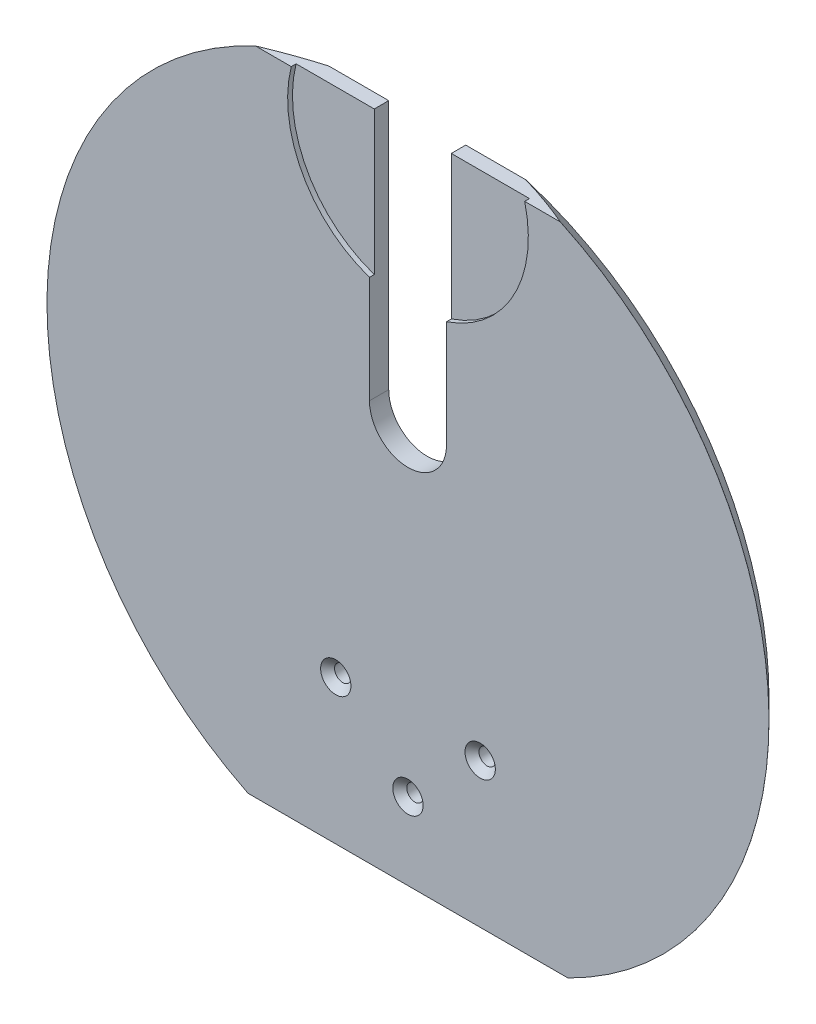
ISO-10303-21;
HEADER;
FILE_DESCRIPTION(('STEP AP214'),'2;1');
FILE_NAME('part.step','',(''),(''),'','','');
FILE_SCHEMA(('AUTOMOTIVE_DESIGN { 1 0 10303 214 1 1 1 1 }'));
ENDSEC;
DATA;
#1=APPLICATION_CONTEXT('core data for automotive mechanical design processes');
#2=APPLICATION_PROTOCOL_DEFINITION('international standard','automotive_design',2000,#1);
#3=PRODUCT_CONTEXT('',#1,'mechanical');
#4=PRODUCT('Part','Part','',(#3));
#5=PRODUCT_RELATED_PRODUCT_CATEGORY('part','',(#4));
#6=PRODUCT_DEFINITION_FORMATION('','',#4);
#7=PRODUCT_DEFINITION_CONTEXT('part definition',#1,'design');
#8=PRODUCT_DEFINITION('design','',#6,#7);
#9=PRODUCT_DEFINITION_SHAPE('','',#8);
#10=(LENGTH_UNIT() NAMED_UNIT(*) SI_UNIT(.MILLI.,.METRE.));
#11=(NAMED_UNIT(*) PLANE_ANGLE_UNIT() SI_UNIT($,.RADIAN.));
#12=(NAMED_UNIT(*) SI_UNIT($,.STERADIAN.) SOLID_ANGLE_UNIT());
#13=UNCERTAINTY_MEASURE_WITH_UNIT(LENGTH_MEASURE(1.E-05),#10,'distance_accuracy_value','');
#14=(GEOMETRIC_REPRESENTATION_CONTEXT(3) GLOBAL_UNCERTAINTY_ASSIGNED_CONTEXT((#13)) GLOBAL_UNIT_ASSIGNED_CONTEXT((#10,
#11,#12)) REPRESENTATION_CONTEXT('',''));
#15=CARTESIAN_POINT('',(0.,0.,0.));
#16=DIRECTION('',(0.,0.,1.));
#17=DIRECTION('',(1.,0.,0.));
#18=AXIS2_PLACEMENT_3D('',#15,#16,#17);
#19=CARTESIAN_POINT('',(-31.6385840391128,68.,4.));
#20=DIRECTION('',(0.,-1.,0.));
#21=DIRECTION('',(0.,0.,-1.));
#22=AXIS2_PLACEMENT_3D('',#19,#20,#21);
#23=PLANE('',#22);
#24=DIRECTION('',(-1.,0.,0.));
#25=VECTOR('',#24,1.);
#26=CARTESIAN_POINT('',(-31.6385840391128,68.,0.));
#27=LINE('',#26,#25);
#28=CARTESIAN_POINT('',(-8.,68.,0.));
#29=VERTEX_POINT('',#28);
#30=CARTESIAN_POINT('',(-20.4553196015118,68.,0.));
#31=VERTEX_POINT('',#30);
#32=EDGE_CURVE('E196',#29,#31,#27,.T.);
#33=ORIENTED_EDGE('',*,*,#32,.T.);
#34=CARTESIAN_POINT('',(-20.4553196015118,68.,0.));
#35=CARTESIAN_POINT('',(-21.4071961725832,68.,0.274195390386932));
#36=CARTESIAN_POINT('',(-22.3543302991443,68.,0.564585403190867));
#37=CARTESIAN_POINT('',(-24.2380537840084,68.,1.17511080406346));
#38=CARTESIAN_POINT('',(-25.1746516878984,68.,1.49521979251113));
#39=CARTESIAN_POINT('',(-27.0378441359943,68.,2.16300342632284));
#40=CARTESIAN_POINT('',(-27.9644394767338,68.,2.51067585805445));
#41=CARTESIAN_POINT('',(-29.8085395341789,68.,3.23169115111727));
#42=CARTESIAN_POINT('',(-30.7260355262787,68.,3.6050563502527));
#43=CARTESIAN_POINT('',(-31.6385840391128,68.,3.99000000000003));
#44=B_SPLINE_CURVE_WITH_KNOTS('',3,(#34,#35,#36,#37,#38,#39,#40,#41,#42,#43),.UNSPECIFIED.,.F.,
.F.,(4,2,2,2,4),(0.,2.97149481745578,5.94037483607534,8.90901666368059,11.8802729176234),.UNSPECIFIED.);
#45=CARTESIAN_POINT('',(-31.6385840391128,68.,3.99000000000004));
#46=VERTEX_POINT('',#45);
#47=EDGE_CURVE('E249',#31,#46,#44,.T.);
#48=ORIENTED_EDGE('',*,*,#47,.T.);
#49=DIRECTION('',(0.,0.,-1.));
#50=VECTOR('',#49,1.);
#51=CARTESIAN_POINT('',(-31.6385840391128,68.,4.));
#52=LINE('',#51,#50);
#53=CARTESIAN_POINT('',(-31.6385840391128,68.,4.));
#54=VERTEX_POINT('',#53);
#55=EDGE_CURVE('E184',#54,#46,#52,.T.);
#56=ORIENTED_EDGE('',*,*,#55,.F.);
#57=DIRECTION('',(-1.,0.,0.));
#58=VECTOR('',#57,1.);
#59=CARTESIAN_POINT('',(-31.6385840391128,68.,4.));
#60=LINE('',#59,#58);
#61=CARTESIAN_POINT('',(-24.2443807922578,68.,4.));
#62=VERTEX_POINT('',#61);
#63=EDGE_CURVE('E185',#62,#54,#60,.T.);
#64=ORIENTED_EDGE('',*,*,#63,.F.);
#65=DIRECTION('',(0.,0.,1.));
#66=VECTOR('',#65,1.);
#67=CARTESIAN_POINT('',(-24.2443807922578,68.,3.));
#68=LINE('',#67,#66);
#69=CARTESIAN_POINT('',(-24.2443807922578,68.,3.));
#70=VERTEX_POINT('',#69);
#71=EDGE_CURVE('E175',#62,#70,#68,.F.);
#72=ORIENTED_EDGE('',*,*,#71,.T.);
#73=DIRECTION('',(-1.,0.,0.));
#74=VECTOR('',#73,1.);
#75=CARTESIAN_POINT('',(-31.6385840391128,68.,3.));
#76=LINE('',#75,#74);
#77=CARTESIAN_POINT('',(-8.,68.,3.));
#78=VERTEX_POINT('',#77);
#79=EDGE_CURVE('E383',#78,#70,#76,.T.);
#80=ORIENTED_EDGE('',*,*,#79,.F.);
#81=DIRECTION('',(0.,0.,1.));
#82=VECTOR('',#81,1.);
#83=CARTESIAN_POINT('',(-8.,68.,-0.00100000000000013));
#84=LINE('',#83,#82);
#85=EDGE_CURVE('E320',#29,#78,#84,.T.);
#86=ORIENTED_EDGE('',*,*,#85,.F.);
#87=EDGE_LOOP('',(#33,#48,#56,#64,#72,#80,#86));
#88=FACE_BOUND('',#87,.T.);
#89=ADVANCED_FACE('F45',(#88),#23,.F.);
#90=CARTESIAN_POINT('',(0.,0.,4.));
#91=DIRECTION('',(0.,0.,1.));
#92=DIRECTION('',(1.,0.,0.));
#93=AXIS2_PLACEMENT_3D('',#90,#91,#92);
#94=PLANE('',#93);
#95=CARTESIAN_POINT('',(0.,61.9,4.));
#96=DIRECTION('',(0.,0.,1.));
#97=DIRECTION('',(1.,0.,0.));
#98=AXIS2_PLACEMENT_3D('',#95,#96,#97);
#99=CIRCLE('',#98,25.);
#100=CARTESIAN_POINT('',(-8.,38.214561435346,4.));
#101=VERTEX_POINT('',#100);
#102=EDGE_CURVE('E165',#62,#101,#99,.T.);
#103=ORIENTED_EDGE('',*,*,#102,.F.);
#104=ORIENTED_EDGE('',*,*,#63,.T.);
#105=CARTESIAN_POINT('',(0.,0.,4.));
#106=DIRECTION('',(0.,0.,1.));
#107=DIRECTION('',(1.,0.,0.));
#108=AXIS2_PLACEMENT_3D('',#105,#106,#107);
#109=CIRCLE('',#108,75.);
#110=CARTESIAN_POINT('',(-33.2264954516723,-67.238381896057,4.));
#111=VERTEX_POINT('',#110);
#112=EDGE_CURVE('E199',#54,#111,#109,.T.);
#113=ORIENTED_EDGE('',*,*,#112,.T.);
#114=DIRECTION('',(1.,0.,0.));
#115=VECTOR('',#114,1.);
#116=CARTESIAN_POINT('',(-33.2264954516723,-67.238381896057,4.));
#117=LINE('',#116,#115);
#118=CARTESIAN_POINT('',(33.2264954516723,-67.238381896057,4.));
#119=VERTEX_POINT('',#118);
#120=EDGE_CURVE('E326',#111,#119,#117,.T.);
#121=ORIENTED_EDGE('',*,*,#120,.T.);
#122=CARTESIAN_POINT('',(0.,0.,4.));
#123=DIRECTION('',(0.,0.,1.));
#124=DIRECTION('',(1.,0.,0.));
#125=AXIS2_PLACEMENT_3D('',#122,#123,#124);
#126=CIRCLE('',#125,75.);
#127=CARTESIAN_POINT('',(31.6385840391128,68.,4.));
#128=VERTEX_POINT('',#127);
#129=EDGE_CURVE('E182',#119,#128,#126,.T.);
#130=ORIENTED_EDGE('',*,*,#129,.T.);
#131=CARTESIAN_POINT('',(24.2443807922578,68.,4.));
#132=VERTEX_POINT('',#131);
#133=EDGE_CURVE('E172',#128,#132,#60,.T.);
#134=ORIENTED_EDGE('',*,*,#133,.T.);
#135=CARTESIAN_POINT('',(8.,38.214561435346,4.));
#136=VERTEX_POINT('',#135);
#137=EDGE_CURVE('E153',#136,#132,#99,.T.);
#138=ORIENTED_EDGE('',*,*,#137,.F.);
#139=DIRECTION('',(0.,1.,0.));
#140=VECTOR('',#139,1.);
#141=CARTESIAN_POINT('',(8.,0.,4.));
#142=LINE('',#141,#140);
#143=CARTESIAN_POINT('',(8.,16.,4.));
#144=VERTEX_POINT('',#143);
#145=EDGE_CURVE('E363',#144,#136,#142,.T.);
#146=ORIENTED_EDGE('',*,*,#145,.F.);
#147=CARTESIAN_POINT('',(0.,16.,4.));
#148=DIRECTION('',(0.,0.,1.));
#149=DIRECTION('',(1.,0.,0.));
#150=AXIS2_PLACEMENT_3D('',#147,#148,#149);
#151=CIRCLE('',#150,8.);
#152=CARTESIAN_POINT('',(-8.,16.,4.));
#153=VERTEX_POINT('',#152);
#154=EDGE_CURVE('E369',#153,#144,#151,.T.);
#155=ORIENTED_EDGE('',*,*,#154,.F.);
#156=DIRECTION('',(0.,1.,0.));
#157=VECTOR('',#156,1.);
#158=CARTESIAN_POINT('',(-8.,0.,4.));
#159=LINE('',#158,#157);
#160=EDGE_CURVE('E372',#153,#101,#159,.T.);
#161=ORIENTED_EDGE('',*,*,#160,.T.);
#162=EDGE_LOOP('',(#103,#104,#113,#121,#130,#134,#138,#146,#155,#161));
#163=FACE_BOUND('',#162,.T.);
#164=CARTESIAN_POINT('',(-15.,-37.238381896057,4.));
#165=DIRECTION('',(0.,0.,1.));
#166=DIRECTION('',(1.,0.,0.));
#167=AXIS2_PLACEMENT_3D('',#164,#165,#166);
#168=CIRCLE('',#167,3.15);
#169=CARTESIAN_POINT('',(-11.85,-37.238381896057,4.));
#170=VERTEX_POINT('',#169);
#171=EDGE_CURVE('E354',#170,#170,#168,.T.);
#172=ORIENTED_EDGE('',*,*,#171,.F.);
#173=EDGE_LOOP('',(#172));
#174=FACE_BOUND('',#173,.T.);
#175=CARTESIAN_POINT('',(0.,-51.238381896057,4.));
#176=DIRECTION('',(0.,0.,1.));
#177=DIRECTION('',(1.,0.,0.));
#178=AXIS2_PLACEMENT_3D('',#175,#176,#177);
#179=CIRCLE('',#178,3.15);
#180=CARTESIAN_POINT('',(3.15,-51.238381896057,4.));
#181=VERTEX_POINT('',#180);
#182=EDGE_CURVE('E345',#181,#181,#179,.T.);
#183=ORIENTED_EDGE('',*,*,#182,.F.);
#184=EDGE_LOOP('',(#183));
#185=FACE_BOUND('',#184,.T.);
#186=CARTESIAN_POINT('',(15.,-37.238381896057,4.));
#187=DIRECTION('',(0.,0.,1.));
#188=DIRECTION('',(1.,0.,0.));
#189=AXIS2_PLACEMENT_3D('',#186,#187,#188);
#190=CIRCLE('',#189,3.15);
#191=CARTESIAN_POINT('',(18.15,-37.238381896057,4.));
#192=VERTEX_POINT('',#191);
#193=EDGE_CURVE('E336',#192,#192,#190,.T.);
#194=ORIENTED_EDGE('',*,*,#193,.F.);
#195=EDGE_LOOP('',(#194));
#196=FACE_BOUND('',#195,.T.);
#197=ADVANCED_FACE('F179',(#163,#174,#185,#196),#94,.T.);
#198=CARTESIAN_POINT('',(0.,0.,0.));
#199=DIRECTION('',(0.,0.,1.));
#200=DIRECTION('',(1.,0.,0.));
#201=AXIS2_PLACEMENT_3D('',#198,#199,#200);
#202=PLANE('',#201);
#203=CARTESIAN_POINT('',(15.,-37.238381896057,0.));
#204=DIRECTION('',(0.,0.,1.));
#205=DIRECTION('',(1.,0.,0.));
#206=AXIS2_PLACEMENT_3D('',#203,#204,#205);
#207=CIRCLE('',#206,1.7);
#208=CARTESIAN_POINT('',(16.7,-37.238381896057,0.));
#209=VERTEX_POINT('',#208);
#210=EDGE_CURVE('E197',#209,#209,#207,.T.);
#211=ORIENTED_EDGE('',*,*,#210,.T.);
#212=EDGE_LOOP('',(#211));
#213=FACE_BOUND('',#212,.T.);
#214=CARTESIAN_POINT('',(0.,-51.238381896057,0.));
#215=DIRECTION('',(0.,0.,1.));
#216=DIRECTION('',(1.,0.,0.));
#217=AXIS2_PLACEMENT_3D('',#214,#215,#216);
#218=CIRCLE('',#217,1.7);
#219=CARTESIAN_POINT('',(1.7,-51.238381896057,0.));
#220=VERTEX_POINT('',#219);
#221=EDGE_CURVE('E339',#220,#220,#218,.T.);
#222=ORIENTED_EDGE('',*,*,#221,.T.);
#223=EDGE_LOOP('',(#222));
#224=FACE_BOUND('',#223,.T.);
#225=CARTESIAN_POINT('',(-15.,-37.238381896057,0.));
#226=DIRECTION('',(0.,0.,1.));
#227=DIRECTION('',(1.,0.,0.));
#228=AXIS2_PLACEMENT_3D('',#225,#226,#227);
#229=CIRCLE('',#228,1.7);
#230=CARTESIAN_POINT('',(-13.3,-37.238381896057,0.));
#231=VERTEX_POINT('',#230);
#232=EDGE_CURVE('E348',#231,#231,#229,.T.);
#233=ORIENTED_EDGE('',*,*,#232,.T.);
#234=EDGE_LOOP('',(#233));
#235=FACE_BOUND('',#234,.T.);
#236=DIRECTION('',(1.,0.,0.));
#237=VECTOR('',#236,1.);
#238=CARTESIAN_POINT('',(-33.2264954516723,-67.238381896057,0.));
#239=LINE('',#238,#237);
#240=CARTESIAN_POINT('',(-22.8346250242913,-67.238381896057,0.));
#241=VERTEX_POINT('',#240);
#242=CARTESIAN_POINT('',(22.8346250242913,-67.238381896057,0.));
#243=VERTEX_POINT('',#242);
#244=EDGE_CURVE('E193',#241,#243,#239,.T.);
#245=ORIENTED_EDGE('',*,*,#244,.F.);
#246=CARTESIAN_POINT('',(0.,0.,0.));
#247=DIRECTION('',(0.,0.,1.));
#248=DIRECTION('',(1.,0.,0.));
#249=AXIS2_PLACEMENT_3D('',#246,#247,#248);
#250=CIRCLE('',#249,71.0099999999999);
#251=EDGE_CURVE('E73',#241,#31,#250,.F.);
#252=ORIENTED_EDGE('',*,*,#251,.T.);
#253=ORIENTED_EDGE('',*,*,#32,.F.);
#254=DIRECTION('',(0.,-1.,0.));
#255=VECTOR('',#254,1.);
#256=CARTESIAN_POINT('',(-8.,0.,0.));
#257=LINE('',#256,#255);
#258=CARTESIAN_POINT('',(-8.,16.,0.));
#259=VERTEX_POINT('',#258);
#260=EDGE_CURVE('E375',#29,#259,#257,.T.);
#261=ORIENTED_EDGE('',*,*,#260,.T.);
#262=CARTESIAN_POINT('',(0.,16.,0.));
#263=DIRECTION('',(0.,0.,1.));
#264=DIRECTION('',(1.,0.,0.));
#265=AXIS2_PLACEMENT_3D('',#262,#263,#264);
#266=CIRCLE('',#265,8.);
#267=CARTESIAN_POINT('',(8.,16.,0.));
#268=VERTEX_POINT('',#267);
#269=EDGE_CURVE('E357',#268,#259,#266,.F.);
#270=ORIENTED_EDGE('',*,*,#269,.F.);
#271=DIRECTION('',(0.,-1.,0.));
#272=VECTOR('',#271,1.);
#273=CARTESIAN_POINT('',(8.,0.,0.));
#274=LINE('',#273,#272);
#275=CARTESIAN_POINT('',(8.,68.,0.));
#276=VERTEX_POINT('',#275);
#277=EDGE_CURVE('E377',#276,#268,#274,.T.);
#278=ORIENTED_EDGE('',*,*,#277,.F.);
#279=CARTESIAN_POINT('',(20.4553196015118,68.,0.));
#280=VERTEX_POINT('',#279);
#281=EDGE_CURVE('E198',#280,#276,#27,.T.);
#282=ORIENTED_EDGE('',*,*,#281,.F.);
#283=CARTESIAN_POINT('',(0.,0.,0.));
#284=DIRECTION('',(0.,0.,1.));
#285=DIRECTION('',(1.,0.,0.));
#286=AXIS2_PLACEMENT_3D('',#283,#284,#285);
#287=CIRCLE('',#286,71.0099999999999);
#288=EDGE_CURVE('E403',#280,#243,#287,.F.);
#289=ORIENTED_EDGE('',*,*,#288,.T.);
#290=EDGE_LOOP('',(#245,#252,#253,#261,#270,#278,#282,#289));
#291=FACE_BOUND('',#290,.T.);
#292=ADVANCED_FACE('F237',(#213,#224,#235,#291),#202,.F.);
#293=CARTESIAN_POINT('',(0.,0.,4.));
#294=DIRECTION('',(0.,0.,-1.));
#295=DIRECTION('',(-1.,0.,0.));
#296=AXIS2_PLACEMENT_3D('',#293,#294,#295);
#297=CYLINDRICAL_SURFACE('',#296,75.);
#298=ORIENTED_EDGE('',*,*,#55,.T.);
#299=CARTESIAN_POINT('',(0.,0.,3.99000000000004));
#300=DIRECTION('',(0.,0.,1.));
#301=DIRECTION('',(1.,0.,0.));
#302=AXIS2_PLACEMENT_3D('',#299,#300,#301);
#303=CIRCLE('',#302,75.);
#304=CARTESIAN_POINT('',(-33.2264954516723,-67.238381896057,3.99000000000004));
#305=VERTEX_POINT('',#304);
#306=EDGE_CURVE('E211',#46,#305,#303,.T.);
#307=ORIENTED_EDGE('',*,*,#306,.T.);
#308=DIRECTION('',(0.,0.,-1.));
#309=VECTOR('',#308,1.);
#310=CARTESIAN_POINT('',(-33.2264954516723,-67.238381896057,4.));
#311=LINE('',#310,#309);
#312=EDGE_CURVE('E205',#111,#305,#311,.T.);
#313=ORIENTED_EDGE('',*,*,#312,.F.);
#314=ORIENTED_EDGE('',*,*,#112,.F.);
#315=EDGE_LOOP('',(#298,#307,#313,#314));
#316=FACE_BOUND('',#315,.T.);
#317=ADVANCED_FACE('F233',(#316),#297,.T.);
#318=CARTESIAN_POINT('',(-33.2264954516723,-67.238381896057,4.));
#319=DIRECTION('',(0.,1.,0.));
#320=DIRECTION('',(0.,0.,1.));
#321=AXIS2_PLACEMENT_3D('',#318,#319,#320);
#322=PLANE('',#321);
#323=ORIENTED_EDGE('',*,*,#312,.T.);
#324=CARTESIAN_POINT('',(-33.2264954516723,-67.238381896057,3.99000000000004));
#325=CARTESIAN_POINT('',(-32.3777243089443,-67.238381896057,3.61399064053465));
#326=CARTESIAN_POINT('',(-31.524635672575,-67.238381896057,3.24762278774321));
#327=CARTESIAN_POINT('',(-29.8103162609571,-67.238381896057,2.53622130675004));
#328=CARTESIAN_POINT('',(-28.9490916019565,-67.238381896057,2.19117292692699));
#329=CARTESIAN_POINT('',(-27.2177504063399,-67.238381896057,1.52390912678284));
#330=CARTESIAN_POINT('',(-26.3476333099363,-67.238381896057,1.20169515416708));
#331=CARTESIAN_POINT('',(-24.5980108390327,-67.238381896057,0.581846726944262));
#332=CARTESIAN_POINT('',(-23.7184993157559,-67.238381896057,0.284229646116194));
#333=CARTESIAN_POINT('',(-22.8346250242913,-67.238381896057,0.));
#334=B_SPLINE_CURVE_WITH_KNOTS('',3,(#324,#325,#326,#327,#328,#329,#330,#331,#332,#333),
.UNSPECIFIED.,.F.,.F.,(4,2,2,2,4),(0.,2.78498925608249,5.56802939629484,8.35124582416847,
11.1364116412066),.UNSPECIFIED.);
#335=EDGE_CURVE('E221',#305,#241,#334,.T.);
#336=ORIENTED_EDGE('',*,*,#335,.T.);
#337=ORIENTED_EDGE('',*,*,#244,.T.);
#338=CARTESIAN_POINT('',(22.8346250242913,-67.238381896057,0.));
#339=CARTESIAN_POINT('',(23.7184993157559,-67.238381896057,0.284229646116202));
#340=CARTESIAN_POINT('',(24.5980108390327,-67.238381896057,0.581846726944266));
#341=CARTESIAN_POINT('',(26.3476333099363,-67.238381896057,1.20169515416708));
#342=CARTESIAN_POINT('',(27.2177504063399,-67.238381896057,1.52390912678283));
#343=CARTESIAN_POINT('',(28.9490916019565,-67.238381896057,2.19117292692697));
#344=CARTESIAN_POINT('',(29.8103162609571,-67.238381896057,2.53622130675003));
#345=CARTESIAN_POINT('',(31.524635672575,-67.238381896057,3.2476227877432));
#346=CARTESIAN_POINT('',(32.3777243089442,-67.238381896057,3.61399064053464));
#347=CARTESIAN_POINT('',(33.2264954516723,-67.238381896057,3.99000000000003));
#348=B_SPLINE_CURVE_WITH_KNOTS('',3,(#338,#339,#340,#341,#342,#343,#344,#345,#346,#347),
.UNSPECIFIED.,.F.,.F.,(4,2,2,2,4),(0.,2.78516581703812,5.56838224491175,8.35142238512408,
11.1364116412066),.UNSPECIFIED.);
#349=CARTESIAN_POINT('',(33.2264954516723,-67.238381896057,3.99000000000004));
#350=VERTEX_POINT('',#349);
#351=EDGE_CURVE('E214',#243,#350,#348,.T.);
#352=ORIENTED_EDGE('',*,*,#351,.T.);
#353=DIRECTION('',(0.,0.,-1.));
#354=VECTOR('',#353,1.);
#355=CARTESIAN_POINT('',(33.2264954516723,-67.238381896057,4.));
#356=LINE('',#355,#354);
#357=EDGE_CURVE('E202',#119,#350,#356,.T.);
#358=ORIENTED_EDGE('',*,*,#357,.F.);
#359=ORIENTED_EDGE('',*,*,#120,.F.);
#360=EDGE_LOOP('',(#323,#336,#337,#352,#358,#359));
#361=FACE_BOUND('',#360,.T.);
#362=ADVANCED_FACE('F227',(#361),#322,.F.);
#363=CARTESIAN_POINT('',(0.,0.,4.));
#364=DIRECTION('',(0.,0.,-1.));
#365=DIRECTION('',(-1.,0.,0.));
#366=AXIS2_PLACEMENT_3D('',#363,#364,#365);
#367=CYLINDRICAL_SURFACE('',#366,75.);
#368=ORIENTED_EDGE('',*,*,#357,.T.);
#369=CARTESIAN_POINT('',(0.,0.,3.99000000000004));
#370=DIRECTION('',(0.,0.,1.));
#371=DIRECTION('',(1.,0.,0.));
#372=AXIS2_PLACEMENT_3D('',#369,#370,#371);
#373=CIRCLE('',#372,75.);
#374=CARTESIAN_POINT('',(31.6385840391128,68.,3.99000000000004));
#375=VERTEX_POINT('',#374);
#376=EDGE_CURVE('E60',#350,#375,#373,.T.);
#377=ORIENTED_EDGE('',*,*,#376,.T.);
#378=DIRECTION('',(0.,0.,-1.));
#379=VECTOR('',#378,1.);
#380=CARTESIAN_POINT('',(31.6385840391128,68.,4.));
#381=LINE('',#380,#379);
#382=EDGE_CURVE('E188',#128,#375,#381,.T.);
#383=ORIENTED_EDGE('',*,*,#382,.F.);
#384=ORIENTED_EDGE('',*,*,#129,.F.);
#385=EDGE_LOOP('',(#368,#377,#383,#384));
#386=FACE_BOUND('',#385,.T.);
#387=ADVANCED_FACE('F232',(#386),#367,.T.);
#388=ORIENTED_EDGE('',*,*,#382,.T.);
#389=CARTESIAN_POINT('',(31.6385840391128,68.,3.99000000000004));
#390=CARTESIAN_POINT('',(30.7260355262787,68.,3.6050563502527));
#391=CARTESIAN_POINT('',(29.8085395341789,68.,3.23169115111727));
#392=CARTESIAN_POINT('',(27.9644394767338,68.,2.51067585805445));
#393=CARTESIAN_POINT('',(27.0378441359944,68.,2.16300342632283));
#394=CARTESIAN_POINT('',(25.1746516878984,68.,1.49521979251113));
#395=CARTESIAN_POINT('',(24.2380537840084,68.,1.17511080406346));
#396=CARTESIAN_POINT('',(22.3543302991443,68.,0.564585403190867));
#397=CARTESIAN_POINT('',(21.4071961725832,68.,0.274195390386929));
#398=CARTESIAN_POINT('',(20.4553196015118,68.,0.));
#399=B_SPLINE_CURVE_WITH_KNOTS('',3,(#389,#390,#391,#392,#393,#394,#395,#396,#397,#398),
.UNSPECIFIED.,.F.,.F.,(4,2,2,2,4),(0.,2.97125625394283,5.93989808154809,8.90877810016767,
11.8802729176234),.UNSPECIFIED.);
#400=EDGE_CURVE('E11',#375,#280,#399,.T.);
#401=ORIENTED_EDGE('',*,*,#400,.T.);
#402=ORIENTED_EDGE('',*,*,#281,.T.);
#403=DIRECTION('',(0.,0.,1.));
#404=VECTOR('',#403,1.);
#405=CARTESIAN_POINT('',(8.,68.,-0.00100000000000013));
#406=LINE('',#405,#404);
#407=CARTESIAN_POINT('',(8.,68.,3.));
#408=VERTEX_POINT('',#407);
#409=EDGE_CURVE('E365',#276,#408,#406,.T.);
#410=ORIENTED_EDGE('',*,*,#409,.T.);
#411=DIRECTION('',(-1.,0.,0.));
#412=VECTOR('',#411,1.);
#413=CARTESIAN_POINT('',(-31.6385840391128,68.,3.));
#414=LINE('',#413,#412);
#415=CARTESIAN_POINT('',(24.2443807922578,68.,3.));
#416=VERTEX_POINT('',#415);
#417=EDGE_CURVE('E174',#416,#408,#414,.T.);
#418=ORIENTED_EDGE('',*,*,#417,.F.);
#419=DIRECTION('',(0.,0.,1.));
#420=VECTOR('',#419,1.);
#421=CARTESIAN_POINT('',(24.2443807922578,68.,3.));
#422=LINE('',#421,#420);
#423=EDGE_CURVE('E157',#416,#132,#422,.T.);
#424=ORIENTED_EDGE('',*,*,#423,.T.);
#425=ORIENTED_EDGE('',*,*,#133,.F.);
#426=EDGE_LOOP('',(#388,#401,#402,#410,#418,#424,#425));
#427=FACE_BOUND('',#426,.T.);
#428=ADVANCED_FACE('F171',(#427),#23,.F.);
#429=CARTESIAN_POINT('',(15.,-37.238381896057,4.));
#430=DIRECTION('',(0.,0.,1.));
#431=DIRECTION('',(1.,0.,0.));
#432=AXIS2_PLACEMENT_3D('',#429,#430,#431);
#433=CYLINDRICAL_SURFACE('',#432,1.7);
#434=ORIENTED_EDGE('',*,*,#210,.F.);
#435=EDGE_LOOP('',(#434));
#436=FACE_BOUND('',#435,.T.);
#437=CARTESIAN_POINT('',(15.,-37.238381896057,2.55));
#438=DIRECTION('',(0.,0.,1.));
#439=DIRECTION('',(1.,0.,0.));
#440=AXIS2_PLACEMENT_3D('',#437,#438,#439);
#441=CIRCLE('',#440,1.7);
#442=CARTESIAN_POINT('',(16.7,-37.238381896057,2.55));
#443=VERTEX_POINT('',#442);
#444=EDGE_CURVE('E333',#443,#443,#441,.T.);
#445=ORIENTED_EDGE('',*,*,#444,.T.);
#446=EDGE_LOOP('',(#445));
#447=FACE_BOUND('',#446,.T.);
#448=ADVANCED_FACE('F258',(#436,#447),#433,.F.);
#449=CARTESIAN_POINT('',(15.,-37.238381896057,4.));
#450=DIRECTION('',(0.,0.,1.));
#451=DIRECTION('',(1.,0.,0.));
#452=AXIS2_PLACEMENT_3D('',#449,#450,#451);
#453=CONICAL_SURFACE('',#452,3.15,0.785398163397448);
#454=ORIENTED_EDGE('',*,*,#444,.F.);
#455=EDGE_LOOP('',(#454));
#456=FACE_BOUND('',#455,.T.);
#457=ORIENTED_EDGE('',*,*,#193,.T.);
#458=EDGE_LOOP('',(#457));
#459=FACE_BOUND('',#458,.T.);
#460=ADVANCED_FACE('F267',(#456,#459),#453,.F.);
#461=CARTESIAN_POINT('',(0.,-51.238381896057,4.));
#462=DIRECTION('',(0.,0.,1.));
#463=DIRECTION('',(1.,0.,0.));
#464=AXIS2_PLACEMENT_3D('',#461,#462,#463);
#465=CYLINDRICAL_SURFACE('',#464,1.7);
#466=ORIENTED_EDGE('',*,*,#221,.F.);
#467=EDGE_LOOP('',(#466));
#468=FACE_BOUND('',#467,.T.);
#469=CARTESIAN_POINT('',(0.,-51.238381896057,2.55));
#470=DIRECTION('',(0.,0.,1.));
#471=DIRECTION('',(1.,0.,0.));
#472=AXIS2_PLACEMENT_3D('',#469,#470,#471);
#473=CIRCLE('',#472,1.7);
#474=CARTESIAN_POINT('',(1.7,-51.238381896057,2.55));
#475=VERTEX_POINT('',#474);
#476=EDGE_CURVE('E342',#475,#475,#473,.T.);
#477=ORIENTED_EDGE('',*,*,#476,.T.);
#478=EDGE_LOOP('',(#477));
#479=FACE_BOUND('',#478,.T.);
#480=ADVANCED_FACE('F271',(#468,#479),#465,.F.);
#481=CARTESIAN_POINT('',(0.,-51.238381896057,4.));
#482=DIRECTION('',(0.,0.,1.));
#483=DIRECTION('',(1.,0.,0.));
#484=AXIS2_PLACEMENT_3D('',#481,#482,#483);
#485=CONICAL_SURFACE('',#484,3.15,0.785398163397447);
#486=ORIENTED_EDGE('',*,*,#476,.F.);
#487=EDGE_LOOP('',(#486));
#488=FACE_BOUND('',#487,.T.);
#489=ORIENTED_EDGE('',*,*,#182,.T.);
#490=EDGE_LOOP('',(#489));
#491=FACE_BOUND('',#490,.T.);
#492=ADVANCED_FACE('F275',(#488,#491),#485,.F.);
#493=CARTESIAN_POINT('',(-15.,-37.238381896057,4.));
#494=DIRECTION('',(0.,0.,1.));
#495=DIRECTION('',(1.,0.,0.));
#496=AXIS2_PLACEMENT_3D('',#493,#494,#495);
#497=CYLINDRICAL_SURFACE('',#496,1.7);
#498=ORIENTED_EDGE('',*,*,#232,.F.);
#499=EDGE_LOOP('',(#498));
#500=FACE_BOUND('',#499,.T.);
#501=CARTESIAN_POINT('',(-15.,-37.238381896057,2.55));
#502=DIRECTION('',(0.,0.,1.));
#503=DIRECTION('',(1.,0.,0.));
#504=AXIS2_PLACEMENT_3D('',#501,#502,#503);
#505=CIRCLE('',#504,1.7);
#506=CARTESIAN_POINT('',(-13.3,-37.238381896057,2.55));
#507=VERTEX_POINT('',#506);
#508=EDGE_CURVE('E351',#507,#507,#505,.T.);
#509=ORIENTED_EDGE('',*,*,#508,.T.);
#510=EDGE_LOOP('',(#509));
#511=FACE_BOUND('',#510,.T.);
#512=ADVANCED_FACE('F279',(#500,#511),#497,.F.);
#513=CARTESIAN_POINT('',(-15.,-37.238381896057,4.));
#514=DIRECTION('',(0.,0.,1.));
#515=DIRECTION('',(1.,0.,0.));
#516=AXIS2_PLACEMENT_3D('',#513,#514,#515);
#517=CONICAL_SURFACE('',#516,3.15,0.785398163397448);
#518=ORIENTED_EDGE('',*,*,#508,.F.);
#519=EDGE_LOOP('',(#518));
#520=FACE_BOUND('',#519,.T.);
#521=ORIENTED_EDGE('',*,*,#171,.T.);
#522=EDGE_LOOP('',(#521));
#523=FACE_BOUND('',#522,.T.);
#524=ADVANCED_FACE('F283',(#520,#523),#517,.F.);
#525=CARTESIAN_POINT('',(-8.,0.,-0.00100000000000013));
#526=DIRECTION('',(1.,0.,0.));
#527=DIRECTION('',(0.,0.,-1.));
#528=AXIS2_PLACEMENT_3D('',#525,#526,#527);
#529=PLANE('',#528);
#530=DIRECTION('',(0.,0.,1.));
#531=VECTOR('',#530,1.);
#532=CARTESIAN_POINT('',(-8.,38.214561435346,3.));
#533=LINE('',#532,#531);
#534=CARTESIAN_POINT('',(-8.,38.214561435346,3.));
#535=VERTEX_POINT('',#534);
#536=EDGE_CURVE('E176',#101,#535,#533,.F.);
#537=ORIENTED_EDGE('',*,*,#536,.F.);
#538=ORIENTED_EDGE('',*,*,#160,.F.);
#539=DIRECTION('',(0.,0.,1.));
#540=VECTOR('',#539,1.);
#541=CARTESIAN_POINT('',(-8.,16.,-0.00100000000000013));
#542=LINE('',#541,#540);
#543=EDGE_CURVE('E360',#259,#153,#542,.T.);
#544=ORIENTED_EDGE('',*,*,#543,.F.);
#545=ORIENTED_EDGE('',*,*,#260,.F.);
#546=ORIENTED_EDGE('',*,*,#85,.T.);
#547=DIRECTION('',(0.,-1.,0.));
#548=VECTOR('',#547,1.);
#549=CARTESIAN_POINT('',(-8.,0.,3.));
#550=LINE('',#549,#548);
#551=EDGE_CURVE('E385',#78,#535,#550,.T.);
#552=ORIENTED_EDGE('',*,*,#551,.T.);
#553=EDGE_LOOP('',(#537,#538,#544,#545,#546,#552));
#554=FACE_BOUND('',#553,.T.);
#555=ADVANCED_FACE('F287',(#554),#529,.T.);
#556=CARTESIAN_POINT('',(8.,0.,-0.00100000000000013));
#557=DIRECTION('',(1.,0.,0.));
#558=DIRECTION('',(0.,0.,-1.));
#559=AXIS2_PLACEMENT_3D('',#556,#557,#558);
#560=PLANE('',#559);
#561=ORIENTED_EDGE('',*,*,#145,.T.);
#562=DIRECTION('',(0.,0.,1.));
#563=VECTOR('',#562,1.);
#564=CARTESIAN_POINT('',(8.,38.214561435346,3.));
#565=LINE('',#564,#563);
#566=CARTESIAN_POINT('',(8.,38.214561435346,3.));
#567=VERTEX_POINT('',#566);
#568=EDGE_CURVE('E160',#136,#567,#565,.F.);
#569=ORIENTED_EDGE('',*,*,#568,.T.);
#570=DIRECTION('',(0.,-1.,0.));
#571=VECTOR('',#570,1.);
#572=CARTESIAN_POINT('',(8.,0.,3.));
#573=LINE('',#572,#571);
#574=EDGE_CURVE('E208',#408,#567,#573,.T.);
#575=ORIENTED_EDGE('',*,*,#574,.F.);
#576=ORIENTED_EDGE('',*,*,#409,.F.);
#577=ORIENTED_EDGE('',*,*,#277,.T.);
#578=DIRECTION('',(0.,0.,1.));
#579=VECTOR('',#578,1.);
#580=CARTESIAN_POINT('',(8.,16.,-0.00100000000000013));
#581=LINE('',#580,#579);
#582=EDGE_CURVE('E362',#268,#144,#581,.T.);
#583=ORIENTED_EDGE('',*,*,#582,.T.);
#584=EDGE_LOOP('',(#561,#569,#575,#576,#577,#583));
#585=FACE_BOUND('',#584,.T.);
#586=ADVANCED_FACE('F291',(#585),#560,.F.);
#587=CARTESIAN_POINT('',(0.,16.,-0.00100000000000013));
#588=DIRECTION('',(0.,0.,1.));
#589=DIRECTION('',(1.,0.,0.));
#590=AXIS2_PLACEMENT_3D('',#587,#588,#589);
#591=CYLINDRICAL_SURFACE('',#590,8.);
#592=ORIENTED_EDGE('',*,*,#269,.T.);
#593=ORIENTED_EDGE('',*,*,#543,.T.);
#594=ORIENTED_EDGE('',*,*,#154,.T.);
#595=ORIENTED_EDGE('',*,*,#582,.F.);
#596=EDGE_LOOP('',(#592,#593,#594,#595));
#597=FACE_BOUND('',#596,.T.);
#598=ADVANCED_FACE('F293',(#597),#591,.F.);
#599=CARTESIAN_POINT('',(0.,61.9,3.));
#600=DIRECTION('',(0.,0.,1.));
#601=DIRECTION('',(1.,0.,0.));
#602=AXIS2_PLACEMENT_3D('',#599,#600,#601);
#603=PLANE('',#602);
#604=ORIENTED_EDGE('',*,*,#417,.T.);
#605=ORIENTED_EDGE('',*,*,#574,.T.);
#606=CARTESIAN_POINT('',(0.,61.9,3.));
#607=DIRECTION('',(0.,0.,1.));
#608=DIRECTION('',(1.,0.,0.));
#609=AXIS2_PLACEMENT_3D('',#606,#607,#608);
#610=CIRCLE('',#609,25.);
#611=EDGE_CURVE('E390',#567,#416,#610,.T.);
#612=ORIENTED_EDGE('',*,*,#611,.T.);
#613=EDGE_LOOP('',(#604,#605,#612));
#614=FACE_BOUND('',#613,.T.);
#615=ADVANCED_FACE('F296',(#614),#603,.T.);
#616=CARTESIAN_POINT('',(0.,61.9,3.));
#617=DIRECTION('',(0.,0.,1.));
#618=DIRECTION('',(1.,0.,0.));
#619=AXIS2_PLACEMENT_3D('',#616,#617,#618);
#620=CYLINDRICAL_SURFACE('',#619,25.);
#621=ORIENTED_EDGE('',*,*,#611,.F.);
#622=ORIENTED_EDGE('',*,*,#568,.F.);
#623=ORIENTED_EDGE('',*,*,#137,.T.);
#624=ORIENTED_EDGE('',*,*,#423,.F.);
#625=EDGE_LOOP('',(#621,#622,#623,#624));
#626=FACE_BOUND('',#625,.T.);
#627=ADVANCED_FACE('F156',(#626),#620,.F.);
#628=ORIENTED_EDGE('',*,*,#102,.T.);
#629=ORIENTED_EDGE('',*,*,#536,.T.);
#630=EDGE_CURVE('E388',#70,#535,#610,.T.);
#631=ORIENTED_EDGE('',*,*,#630,.F.);
#632=ORIENTED_EDGE('',*,*,#71,.F.);
#633=EDGE_LOOP('',(#628,#629,#631,#632));
#634=FACE_BOUND('',#633,.T.);
#635=ADVANCED_FACE('F301',(#634),#620,.F.);
#636=ORIENTED_EDGE('',*,*,#79,.T.);
#637=ORIENTED_EDGE('',*,*,#630,.T.);
#638=ORIENTED_EDGE('',*,*,#551,.F.);
#639=EDGE_LOOP('',(#636,#637,#638));
#640=FACE_BOUND('',#639,.T.);
#641=ADVANCED_FACE('F245',(#640),#603,.T.);
#642=CARTESIAN_POINT('',(0.,0.,3.99000000000004));
#643=DIRECTION('',(0.,0.,1.));
#644=DIRECTION('',(1.,0.,0.));
#645=AXIS2_PLACEMENT_3D('',#642,#643,#644);
#646=CONICAL_SURFACE('',#645,75.,0.785398163397452);
#647=ORIENTED_EDGE('',*,*,#47,.F.);
#648=ORIENTED_EDGE('',*,*,#251,.F.);
#649=ORIENTED_EDGE('',*,*,#335,.F.);
#650=ORIENTED_EDGE('',*,*,#306,.F.);
#651=EDGE_LOOP('',(#647,#648,#649,#650));
#652=FACE_BOUND('',#651,.T.);
#653=ADVANCED_FACE('F240',(#652),#646,.T.);
#654=CARTESIAN_POINT('',(0.,0.,3.99000000000004));
#655=DIRECTION('',(0.,0.,1.));
#656=DIRECTION('',(1.,0.,0.));
#657=AXIS2_PLACEMENT_3D('',#654,#655,#656);
#658=CONICAL_SURFACE('',#657,75.,0.785398163397452);
#659=ORIENTED_EDGE('',*,*,#351,.F.);
#660=ORIENTED_EDGE('',*,*,#288,.F.);
#661=ORIENTED_EDGE('',*,*,#400,.F.);
#662=ORIENTED_EDGE('',*,*,#376,.F.);
#663=EDGE_LOOP('',(#659,#660,#661,#662));
#664=FACE_BOUND('',#663,.T.);
#665=ADVANCED_FACE('F48',(#664),#658,.T.);
#666=CLOSED_SHELL('',(#89,#197,#292,#317,#362,#387,#428,#448,#460,#480,#492,#512,#524,#555,#586,
#598,#615,#627,#635,#641,#653,#665));
#667=MANIFOLD_SOLID_BREP('B2',#666);
#668=ADVANCED_BREP_SHAPE_REPRESENTATION('',(#18,#667),#14);
#669=SHAPE_DEFINITION_REPRESENTATION(#9,#668);
ENDSEC;
END-ISO-10303-21;
